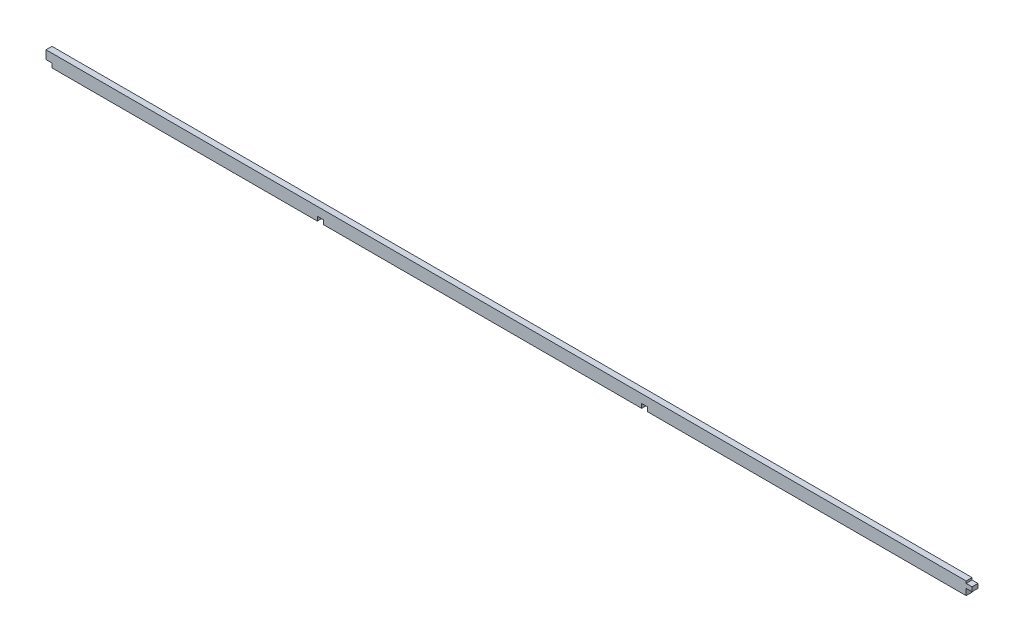
ISO-10303-21;
HEADER;
FILE_DESCRIPTION(('STEP AP214'),'2;1');
FILE_NAME('part.step','',(''),(''),'','','');
FILE_SCHEMA(('AUTOMOTIVE_DESIGN { 1 0 10303 214 1 1 1 1 }'));
ENDSEC;
DATA;
#1=APPLICATION_CONTEXT('core data for automotive mechanical design processes');
#2=APPLICATION_PROTOCOL_DEFINITION('international standard','automotive_design',2000,#1);
#3=PRODUCT_CONTEXT('',#1,'mechanical');
#4=PRODUCT('Part','Part','',(#3));
#5=PRODUCT_RELATED_PRODUCT_CATEGORY('part','',(#4));
#6=PRODUCT_DEFINITION_FORMATION('','',#4);
#7=PRODUCT_DEFINITION_CONTEXT('part definition',#1,'design');
#8=PRODUCT_DEFINITION('design','',#6,#7);
#9=PRODUCT_DEFINITION_SHAPE('','',#8);
#10=(LENGTH_UNIT() NAMED_UNIT(*) SI_UNIT(.MILLI.,.METRE.));
#11=(NAMED_UNIT(*) PLANE_ANGLE_UNIT() SI_UNIT($,.RADIAN.));
#12=(NAMED_UNIT(*) SI_UNIT($,.STERADIAN.) SOLID_ANGLE_UNIT());
#13=UNCERTAINTY_MEASURE_WITH_UNIT(LENGTH_MEASURE(1.E-05),#10,'distance_accuracy_value','');
#14=(GEOMETRIC_REPRESENTATION_CONTEXT(3) GLOBAL_UNCERTAINTY_ASSIGNED_CONTEXT((#13)) GLOBAL_UNIT_ASSIGNED_CONTEXT((#10,
#11,#12)) REPRESENTATION_CONTEXT('',''));
#15=CARTESIAN_POINT('',(0.,0.,0.));
#16=DIRECTION('',(0.,0.,1.));
#17=DIRECTION('',(1.,0.,0.));
#18=AXIS2_PLACEMENT_3D('',#15,#16,#17);
#19=CARTESIAN_POINT('',(433.4,0.,1.4));
#20=DIRECTION('',(-1.,0.,0.));
#21=DIRECTION('',(0.,0.,1.));
#22=AXIS2_PLACEMENT_3D('',#19,#20,#21);
#23=PLANE('',#22);
#24=DIRECTION('',(0.,1.,0.));
#25=VECTOR('',#24,1.);
#26=CARTESIAN_POINT('',(433.4,0.,-1.4));
#27=LINE('',#26,#25);
#28=CARTESIAN_POINT('',(433.4,-1.,-1.4));
#29=VERTEX_POINT('',#28);
#30=CARTESIAN_POINT('',(433.4,0.,-1.4));
#31=VERTEX_POINT('',#30);
#32=EDGE_CURVE('E189',#29,#31,#27,.T.);
#33=ORIENTED_EDGE('',*,*,#32,.T.);
#34=DIRECTION('',(0.,0.,-1.));
#35=VECTOR('',#34,1.);
#36=CARTESIAN_POINT('',(433.4,0.,1.4));
#37=LINE('',#36,#35);
#38=CARTESIAN_POINT('',(433.4,0.,1.4));
#39=VERTEX_POINT('',#38);
#40=EDGE_CURVE('E11',#39,#31,#37,.T.);
#41=ORIENTED_EDGE('',*,*,#40,.F.);
#42=DIRECTION('',(0.,1.,0.));
#43=VECTOR('',#42,1.);
#44=CARTESIAN_POINT('',(433.4,0.,1.4));
#45=LINE('',#44,#43);
#46=CARTESIAN_POINT('',(433.4,-1.,1.4));
#47=VERTEX_POINT('',#46);
#48=EDGE_CURVE('E223',#47,#39,#45,.T.);
#49=ORIENTED_EDGE('',*,*,#48,.F.);
#50=DIRECTION('',(0.,0.,-1.));
#51=VECTOR('',#50,1.);
#52=CARTESIAN_POINT('',(433.4,-1.,1.4));
#53=LINE('',#52,#51);
#54=EDGE_CURVE('E185',#47,#29,#53,.T.);
#55=ORIENTED_EDGE('',*,*,#54,.T.);
#56=EDGE_LOOP('',(#33,#41,#49,#55));
#57=FACE_BOUND('',#56,.T.);
#58=ADVANCED_FACE('F33',(#57),#23,.F.);
#59=CARTESIAN_POINT('',(0.,0.,1.4));
#60=DIRECTION('',(0.,-1.,0.));
#61=DIRECTION('',(0.,0.,-1.));
#62=AXIS2_PLACEMENT_3D('',#59,#60,#61);
#63=PLANE('',#62);
#64=DIRECTION('',(-1.,0.,0.));
#65=VECTOR('',#64,1.);
#66=CARTESIAN_POINT('',(0.,0.,-1.4));
#67=LINE('',#66,#65);
#68=CARTESIAN_POINT('',(0.,0.,-1.4));
#69=VERTEX_POINT('',#68);
#70=EDGE_CURVE('E192',#31,#69,#67,.T.);
#71=ORIENTED_EDGE('',*,*,#70,.T.);
#72=DIRECTION('',(0.,0.,-1.));
#73=VECTOR('',#72,1.);
#74=CARTESIAN_POINT('',(0.,0.,1.4));
#75=LINE('',#74,#73);
#76=CARTESIAN_POINT('',(0.,0.,1.4));
#77=VERTEX_POINT('',#76);
#78=EDGE_CURVE('E41',#77,#69,#75,.T.);
#79=ORIENTED_EDGE('',*,*,#78,.F.);
#80=DIRECTION('',(-1.,0.,0.));
#81=VECTOR('',#80,1.);
#82=CARTESIAN_POINT('',(0.,0.,1.4));
#83=LINE('',#82,#81);
#84=EDGE_CURVE('E122',#39,#77,#83,.T.);
#85=ORIENTED_EDGE('',*,*,#84,.F.);
#86=ORIENTED_EDGE('',*,*,#40,.T.);
#87=EDGE_LOOP('',(#71,#79,#85,#86));
#88=FACE_BOUND('',#87,.T.);
#89=ADVANCED_FACE('F331',(#88),#63,.F.);
#90=CARTESIAN_POINT('',(0.,-4.,1.4));
#91=DIRECTION('',(1.,0.,0.));
#92=DIRECTION('',(0.,0.,-1.));
#93=AXIS2_PLACEMENT_3D('',#90,#91,#92);
#94=PLANE('',#93);
#95=DIRECTION('',(0.,-1.,0.));
#96=VECTOR('',#95,1.);
#97=CARTESIAN_POINT('',(0.,-4.,-1.4));
#98=LINE('',#97,#96);
#99=CARTESIAN_POINT('',(0.,-4.,-1.4));
#100=VERTEX_POINT('',#99);
#101=EDGE_CURVE('E194',#69,#100,#98,.T.);
#102=ORIENTED_EDGE('',*,*,#101,.T.);
#103=DIRECTION('',(0.,0.,-1.));
#104=VECTOR('',#103,1.);
#105=CARTESIAN_POINT('',(0.,-4.,1.4));
#106=LINE('',#105,#104);
#107=CARTESIAN_POINT('',(0.,-4.,1.4));
#108=VERTEX_POINT('',#107);
#109=EDGE_CURVE('E260',#108,#100,#106,.T.);
#110=ORIENTED_EDGE('',*,*,#109,.F.);
#111=DIRECTION('',(0.,-1.,0.));
#112=VECTOR('',#111,1.);
#113=CARTESIAN_POINT('',(0.,-4.,1.4));
#114=LINE('',#113,#112);
#115=EDGE_CURVE('E268',#77,#108,#114,.T.);
#116=ORIENTED_EDGE('',*,*,#115,.F.);
#117=ORIENTED_EDGE('',*,*,#78,.T.);
#118=EDGE_LOOP('',(#102,#110,#116,#117));
#119=FACE_BOUND('',#118,.T.);
#120=ADVANCED_FACE('F266',(#119),#94,.F.);
#121=CARTESIAN_POINT('',(0.,-4.,1.4));
#122=DIRECTION('',(0.,1.,0.));
#123=DIRECTION('',(0.,0.,1.));
#124=AXIS2_PLACEMENT_3D('',#121,#122,#123);
#125=PLANE('',#124);
#126=DIRECTION('',(1.,0.,0.));
#127=VECTOR('',#126,1.);
#128=CARTESIAN_POINT('',(0.,-4.,-1.4));
#129=LINE('',#128,#127);
#130=CARTESIAN_POINT('',(2.80000000000002,-4.,-1.4));
#131=VERTEX_POINT('',#130);
#132=EDGE_CURVE('E196',#100,#131,#129,.T.);
#133=ORIENTED_EDGE('',*,*,#132,.T.);
#134=DIRECTION('',(0.,0.,-1.));
#135=VECTOR('',#134,1.);
#136=CARTESIAN_POINT('',(2.80000000000002,-4.,1.4));
#137=LINE('',#136,#135);
#138=CARTESIAN_POINT('',(2.80000000000002,-4.,1.4));
#139=VERTEX_POINT('',#138);
#140=EDGE_CURVE('E257',#139,#131,#137,.T.);
#141=ORIENTED_EDGE('',*,*,#140,.F.);
#142=DIRECTION('',(1.,0.,0.));
#143=VECTOR('',#142,1.);
#144=CARTESIAN_POINT('',(0.,-4.,1.4));
#145=LINE('',#144,#143);
#146=EDGE_CURVE('E286',#108,#139,#145,.T.);
#147=ORIENTED_EDGE('',*,*,#146,.F.);
#148=ORIENTED_EDGE('',*,*,#109,.T.);
#149=EDGE_LOOP('',(#133,#141,#147,#148));
#150=FACE_BOUND('',#149,.T.);
#151=ADVANCED_FACE('F277',(#150),#125,.F.);
#152=CARTESIAN_POINT('',(2.80000000000002,-4.,1.4));
#153=DIRECTION('',(1.,0.,0.));
#154=DIRECTION('',(0.,1.,0.));
#155=AXIS2_PLACEMENT_3D('',#152,#153,#154);
#156=PLANE('',#155);
#157=DIRECTION('',(0.,-1.,0.));
#158=VECTOR('',#157,1.);
#159=CARTESIAN_POINT('',(2.80000000000002,-4.,-1.4));
#160=LINE('',#159,#158);
#161=CARTESIAN_POINT('',(2.80000000000003,-6.,-1.4));
#162=VERTEX_POINT('',#161);
#163=EDGE_CURVE('E198',#131,#162,#160,.T.);
#164=ORIENTED_EDGE('',*,*,#163,.T.);
#165=DIRECTION('',(0.,0.,-1.));
#166=VECTOR('',#165,1.);
#167=CARTESIAN_POINT('',(2.80000000000003,-6.,1.4));
#168=LINE('',#167,#166);
#169=CARTESIAN_POINT('',(2.80000000000003,-6.,1.4));
#170=VERTEX_POINT('',#169);
#171=EDGE_CURVE('E254',#170,#162,#168,.T.);
#172=ORIENTED_EDGE('',*,*,#171,.F.);
#173=DIRECTION('',(0.,-1.,0.));
#174=VECTOR('',#173,1.);
#175=CARTESIAN_POINT('',(2.80000000000002,-4.,1.4));
#176=LINE('',#175,#174);
#177=EDGE_CURVE('E283',#139,#170,#176,.T.);
#178=ORIENTED_EDGE('',*,*,#177,.F.);
#179=ORIENTED_EDGE('',*,*,#140,.T.);
#180=EDGE_LOOP('',(#164,#172,#178,#179));
#181=FACE_BOUND('',#180,.T.);
#182=ADVANCED_FACE('F281',(#181),#156,.F.);
#183=CARTESIAN_POINT('',(2.80000000000003,-6.,1.4));
#184=DIRECTION('',(0.,1.,0.));
#185=DIRECTION('',(0.,0.,1.));
#186=AXIS2_PLACEMENT_3D('',#183,#184,#185);
#187=PLANE('',#186);
#188=DIRECTION('',(1.,0.,0.));
#189=VECTOR('',#188,1.);
#190=CARTESIAN_POINT('',(2.80000000000003,-6.,-1.4));
#191=LINE('',#190,#189);
#192=CARTESIAN_POINT('',(127.8,-6.,-1.4));
#193=VERTEX_POINT('',#192);
#194=EDGE_CURVE('E200',#162,#193,#191,.T.);
#195=ORIENTED_EDGE('',*,*,#194,.T.);
#196=DIRECTION('',(0.,0.,-1.));
#197=VECTOR('',#196,1.);
#198=CARTESIAN_POINT('',(127.8,-6.,1.4));
#199=LINE('',#198,#197);
#200=CARTESIAN_POINT('',(127.8,-6.,1.4));
#201=VERTEX_POINT('',#200);
#202=EDGE_CURVE('E251',#201,#193,#199,.T.);
#203=ORIENTED_EDGE('',*,*,#202,.F.);
#204=DIRECTION('',(1.,0.,0.));
#205=VECTOR('',#204,1.);
#206=CARTESIAN_POINT('',(2.80000000000003,-6.,1.4));
#207=LINE('',#206,#205);
#208=EDGE_CURVE('E285',#170,#201,#207,.T.);
#209=ORIENTED_EDGE('',*,*,#208,.F.);
#210=ORIENTED_EDGE('',*,*,#171,.T.);
#211=EDGE_LOOP('',(#195,#203,#209,#210));
#212=FACE_BOUND('',#211,.T.);
#213=ADVANCED_FACE('F344',(#212),#187,.F.);
#214=CARTESIAN_POINT('',(127.8,-6.,1.4));
#215=DIRECTION('',(-1.,0.,0.));
#216=DIRECTION('',(0.,0.,1.));
#217=AXIS2_PLACEMENT_3D('',#214,#215,#216);
#218=PLANE('',#217);
#219=DIRECTION('',(0.,1.,0.));
#220=VECTOR('',#219,1.);
#221=CARTESIAN_POINT('',(127.8,-6.,-1.4));
#222=LINE('',#221,#220);
#223=CARTESIAN_POINT('',(127.8,-4.,-1.4));
#224=VERTEX_POINT('',#223);
#225=EDGE_CURVE('E202',#193,#224,#222,.T.);
#226=ORIENTED_EDGE('',*,*,#225,.T.);
#227=DIRECTION('',(0.,0.,-1.));
#228=VECTOR('',#227,1.);
#229=CARTESIAN_POINT('',(127.8,-4.,1.4));
#230=LINE('',#229,#228);
#231=CARTESIAN_POINT('',(127.8,-4.,1.4));
#232=VERTEX_POINT('',#231);
#233=EDGE_CURVE('E248',#232,#224,#230,.T.);
#234=ORIENTED_EDGE('',*,*,#233,.F.);
#235=DIRECTION('',(0.,1.,0.));
#236=VECTOR('',#235,1.);
#237=CARTESIAN_POINT('',(127.8,-6.,1.4));
#238=LINE('',#237,#236);
#239=EDGE_CURVE('E288',#201,#232,#238,.T.);
#240=ORIENTED_EDGE('',*,*,#239,.F.);
#241=ORIENTED_EDGE('',*,*,#202,.T.);
#242=EDGE_LOOP('',(#226,#234,#240,#241));
#243=FACE_BOUND('',#242,.T.);
#244=ADVANCED_FACE('F347',(#243),#218,.F.);
#245=CARTESIAN_POINT('',(127.8,-4.,1.4));
#246=DIRECTION('',(0.,1.,0.));
#247=DIRECTION('',(0.,0.,1.));
#248=AXIS2_PLACEMENT_3D('',#245,#246,#247);
#249=PLANE('',#248);
#250=DIRECTION('',(1.,0.,0.));
#251=VECTOR('',#250,1.);
#252=CARTESIAN_POINT('',(127.8,-4.,-1.4));
#253=LINE('',#252,#251);
#254=CARTESIAN_POINT('',(130.6,-4.,-1.4));
#255=VERTEX_POINT('',#254);
#256=EDGE_CURVE('E204',#224,#255,#253,.T.);
#257=ORIENTED_EDGE('',*,*,#256,.T.);
#258=DIRECTION('',(0.,0.,-1.));
#259=VECTOR('',#258,1.);
#260=CARTESIAN_POINT('',(130.6,-4.,1.4));
#261=LINE('',#260,#259);
#262=CARTESIAN_POINT('',(130.6,-4.,1.4));
#263=VERTEX_POINT('',#262);
#264=EDGE_CURVE('E245',#263,#255,#261,.T.);
#265=ORIENTED_EDGE('',*,*,#264,.F.);
#266=DIRECTION('',(1.,0.,0.));
#267=VECTOR('',#266,1.);
#268=CARTESIAN_POINT('',(127.8,-4.,1.4));
#269=LINE('',#268,#267);
#270=EDGE_CURVE('E294',#232,#263,#269,.T.);
#271=ORIENTED_EDGE('',*,*,#270,.F.);
#272=ORIENTED_EDGE('',*,*,#233,.T.);
#273=EDGE_LOOP('',(#257,#265,#271,#272));
#274=FACE_BOUND('',#273,.T.);
#275=ADVANCED_FACE('F351',(#274),#249,.F.);
#276=CARTESIAN_POINT('',(130.6,-4.,1.4));
#277=DIRECTION('',(1.,0.,0.));
#278=DIRECTION('',(0.,0.,-1.));
#279=AXIS2_PLACEMENT_3D('',#276,#277,#278);
#280=PLANE('',#279);
#281=DIRECTION('',(0.,-1.,0.));
#282=VECTOR('',#281,1.);
#283=CARTESIAN_POINT('',(130.6,-4.,-1.4));
#284=LINE('',#283,#282);
#285=CARTESIAN_POINT('',(130.6,-6.,-1.4));
#286=VERTEX_POINT('',#285);
#287=EDGE_CURVE('E206',#255,#286,#284,.T.);
#288=ORIENTED_EDGE('',*,*,#287,.T.);
#289=DIRECTION('',(0.,0.,-1.));
#290=VECTOR('',#289,1.);
#291=CARTESIAN_POINT('',(130.6,-6.,1.4));
#292=LINE('',#291,#290);
#293=CARTESIAN_POINT('',(130.6,-6.,1.4));
#294=VERTEX_POINT('',#293);
#295=EDGE_CURVE('E242',#294,#286,#292,.T.);
#296=ORIENTED_EDGE('',*,*,#295,.F.);
#297=DIRECTION('',(0.,-1.,0.));
#298=VECTOR('',#297,1.);
#299=CARTESIAN_POINT('',(130.6,-4.,1.4));
#300=LINE('',#299,#298);
#301=EDGE_CURVE('E296',#263,#294,#300,.T.);
#302=ORIENTED_EDGE('',*,*,#301,.F.);
#303=ORIENTED_EDGE('',*,*,#264,.T.);
#304=EDGE_LOOP('',(#288,#296,#302,#303));
#305=FACE_BOUND('',#304,.T.);
#306=ADVANCED_FACE('F355',(#305),#280,.F.);
#307=CARTESIAN_POINT('',(130.6,-6.,1.4));
#308=DIRECTION('',(0.,1.,0.));
#309=DIRECTION('',(0.,0.,1.));
#310=AXIS2_PLACEMENT_3D('',#307,#308,#309);
#311=PLANE('',#310);
#312=DIRECTION('',(1.,0.,0.));
#313=VECTOR('',#312,1.);
#314=CARTESIAN_POINT('',(130.6,-6.,-1.4));
#315=LINE('',#314,#313);
#316=CARTESIAN_POINT('',(280.6,-6.,-1.4));
#317=VERTEX_POINT('',#316);
#318=EDGE_CURVE('E208',#286,#317,#315,.T.);
#319=ORIENTED_EDGE('',*,*,#318,.T.);
#320=DIRECTION('',(0.,0.,-1.));
#321=VECTOR('',#320,1.);
#322=CARTESIAN_POINT('',(280.6,-6.,1.4));
#323=LINE('',#322,#321);
#324=CARTESIAN_POINT('',(280.6,-6.,1.4));
#325=VERTEX_POINT('',#324);
#326=EDGE_CURVE('E239',#325,#317,#323,.T.);
#327=ORIENTED_EDGE('',*,*,#326,.F.);
#328=DIRECTION('',(1.,0.,0.));
#329=VECTOR('',#328,1.);
#330=CARTESIAN_POINT('',(130.6,-6.,1.4));
#331=LINE('',#330,#329);
#332=EDGE_CURVE('E298',#294,#325,#331,.T.);
#333=ORIENTED_EDGE('',*,*,#332,.F.);
#334=ORIENTED_EDGE('',*,*,#295,.T.);
#335=EDGE_LOOP('',(#319,#327,#333,#334));
#336=FACE_BOUND('',#335,.T.);
#337=ADVANCED_FACE('F359',(#336),#311,.F.);
#338=CARTESIAN_POINT('',(280.6,-6.,1.4));
#339=DIRECTION('',(-1.,0.,0.));
#340=DIRECTION('',(0.,0.,1.));
#341=AXIS2_PLACEMENT_3D('',#338,#339,#340);
#342=PLANE('',#341);
#343=DIRECTION('',(0.,1.,0.));
#344=VECTOR('',#343,1.);
#345=CARTESIAN_POINT('',(280.6,-6.,-1.4));
#346=LINE('',#345,#344);
#347=CARTESIAN_POINT('',(280.6,-4.,-1.4));
#348=VERTEX_POINT('',#347);
#349=EDGE_CURVE('E210',#317,#348,#346,.T.);
#350=ORIENTED_EDGE('',*,*,#349,.T.);
#351=DIRECTION('',(0.,0.,-1.));
#352=VECTOR('',#351,1.);
#353=CARTESIAN_POINT('',(280.6,-4.,1.4));
#354=LINE('',#353,#352);
#355=CARTESIAN_POINT('',(280.6,-4.,1.4));
#356=VERTEX_POINT('',#355);
#357=EDGE_CURVE('E236',#356,#348,#354,.T.);
#358=ORIENTED_EDGE('',*,*,#357,.F.);
#359=DIRECTION('',(0.,1.,0.));
#360=VECTOR('',#359,1.);
#361=CARTESIAN_POINT('',(280.6,-6.,1.4));
#362=LINE('',#361,#360);
#363=EDGE_CURVE('E300',#325,#356,#362,.T.);
#364=ORIENTED_EDGE('',*,*,#363,.F.);
#365=ORIENTED_EDGE('',*,*,#326,.T.);
#366=EDGE_LOOP('',(#350,#358,#364,#365));
#367=FACE_BOUND('',#366,.T.);
#368=ADVANCED_FACE('F363',(#367),#342,.F.);
#369=CARTESIAN_POINT('',(280.6,-4.,1.4));
#370=DIRECTION('',(0.,1.,0.));
#371=DIRECTION('',(-1.,0.,0.));
#372=AXIS2_PLACEMENT_3D('',#369,#370,#371);
#373=PLANE('',#372);
#374=DIRECTION('',(1.,0.,0.));
#375=VECTOR('',#374,1.);
#376=CARTESIAN_POINT('',(280.6,-4.,-1.4));
#377=LINE('',#376,#375);
#378=CARTESIAN_POINT('',(283.4,-4.,-1.4));
#379=VERTEX_POINT('',#378);
#380=EDGE_CURVE('E212',#348,#379,#377,.T.);
#381=ORIENTED_EDGE('',*,*,#380,.T.);
#382=DIRECTION('',(0.,0.,-1.));
#383=VECTOR('',#382,1.);
#384=CARTESIAN_POINT('',(283.4,-4.,1.4));
#385=LINE('',#384,#383);
#386=CARTESIAN_POINT('',(283.4,-4.,1.4));
#387=VERTEX_POINT('',#386);
#388=EDGE_CURVE('E233',#387,#379,#385,.T.);
#389=ORIENTED_EDGE('',*,*,#388,.F.);
#390=DIRECTION('',(1.,0.,0.));
#391=VECTOR('',#390,1.);
#392=CARTESIAN_POINT('',(280.6,-4.,1.4));
#393=LINE('',#392,#391);
#394=EDGE_CURVE('E302',#356,#387,#393,.T.);
#395=ORIENTED_EDGE('',*,*,#394,.F.);
#396=ORIENTED_EDGE('',*,*,#357,.T.);
#397=EDGE_LOOP('',(#381,#389,#395,#396));
#398=FACE_BOUND('',#397,.T.);
#399=ADVANCED_FACE('F367',(#398),#373,.F.);
#400=CARTESIAN_POINT('',(283.4,-4.,1.4));
#401=DIRECTION('',(1.,0.,0.));
#402=DIRECTION('',(0.,0.,-1.));
#403=AXIS2_PLACEMENT_3D('',#400,#401,#402);
#404=PLANE('',#403);
#405=DIRECTION('',(0.,-1.,0.));
#406=VECTOR('',#405,1.);
#407=CARTESIAN_POINT('',(283.4,-4.,-1.4));
#408=LINE('',#407,#406);
#409=CARTESIAN_POINT('',(283.4,-6.,-1.4));
#410=VERTEX_POINT('',#409);
#411=EDGE_CURVE('E214',#379,#410,#408,.T.);
#412=ORIENTED_EDGE('',*,*,#411,.T.);
#413=DIRECTION('',(0.,0.,-1.));
#414=VECTOR('',#413,1.);
#415=CARTESIAN_POINT('',(283.4,-6.,1.4));
#416=LINE('',#415,#414);
#417=CARTESIAN_POINT('',(283.4,-6.,1.4));
#418=VERTEX_POINT('',#417);
#419=EDGE_CURVE('E230',#418,#410,#416,.T.);
#420=ORIENTED_EDGE('',*,*,#419,.F.);
#421=DIRECTION('',(0.,-1.,0.));
#422=VECTOR('',#421,1.);
#423=CARTESIAN_POINT('',(283.4,-4.,1.4));
#424=LINE('',#423,#422);
#425=EDGE_CURVE('E304',#387,#418,#424,.T.);
#426=ORIENTED_EDGE('',*,*,#425,.F.);
#427=ORIENTED_EDGE('',*,*,#388,.T.);
#428=EDGE_LOOP('',(#412,#420,#426,#427));
#429=FACE_BOUND('',#428,.T.);
#430=ADVANCED_FACE('F371',(#429),#404,.F.);
#431=CARTESIAN_POINT('',(283.4,-6.,1.4));
#432=DIRECTION('',(0.,1.,0.));
#433=DIRECTION('',(0.,0.,1.));
#434=AXIS2_PLACEMENT_3D('',#431,#432,#433);
#435=PLANE('',#434);
#436=DIRECTION('',(1.,0.,0.));
#437=VECTOR('',#436,1.);
#438=CARTESIAN_POINT('',(283.4,-6.,-1.4));
#439=LINE('',#438,#437);
#440=CARTESIAN_POINT('',(433.4,-6.,-1.4));
#441=VERTEX_POINT('',#440);
#442=EDGE_CURVE('E216',#410,#441,#439,.T.);
#443=ORIENTED_EDGE('',*,*,#442,.T.);
#444=DIRECTION('',(0.,0.,-1.));
#445=VECTOR('',#444,1.);
#446=CARTESIAN_POINT('',(433.4,-6.,1.4));
#447=LINE('',#446,#445);
#448=CARTESIAN_POINT('',(433.4,-6.,1.4));
#449=VERTEX_POINT('',#448);
#450=EDGE_CURVE('E227',#449,#441,#447,.T.);
#451=ORIENTED_EDGE('',*,*,#450,.F.);
#452=DIRECTION('',(1.,0.,0.));
#453=VECTOR('',#452,1.);
#454=CARTESIAN_POINT('',(283.4,-6.,1.4));
#455=LINE('',#454,#453);
#456=EDGE_CURVE('E306',#418,#449,#455,.T.);
#457=ORIENTED_EDGE('',*,*,#456,.F.);
#458=ORIENTED_EDGE('',*,*,#419,.T.);
#459=EDGE_LOOP('',(#443,#451,#457,#458));
#460=FACE_BOUND('',#459,.T.);
#461=ADVANCED_FACE('F312',(#460),#435,.F.);
#462=CARTESIAN_POINT('',(433.4,-3.,1.4));
#463=DIRECTION('',(-1.,0.,0.));
#464=DIRECTION('',(0.,0.,1.));
#465=AXIS2_PLACEMENT_3D('',#462,#463,#464);
#466=PLANE('',#465);
#467=DIRECTION('',(0.,1.,0.));
#468=VECTOR('',#467,1.);
#469=CARTESIAN_POINT('',(433.4,-3.,-1.4));
#470=LINE('',#469,#468);
#471=CARTESIAN_POINT('',(433.4,-3.,-1.4));
#472=VERTEX_POINT('',#471);
#473=EDGE_CURVE('E218',#441,#472,#470,.T.);
#474=ORIENTED_EDGE('',*,*,#473,.T.);
#475=DIRECTION('',(0.,0.,-1.));
#476=VECTOR('',#475,1.);
#477=CARTESIAN_POINT('',(433.4,-3.,1.4));
#478=LINE('',#477,#476);
#479=CARTESIAN_POINT('',(433.4,-3.,1.4));
#480=VERTEX_POINT('',#479);
#481=EDGE_CURVE('E180',#480,#472,#478,.T.);
#482=ORIENTED_EDGE('',*,*,#481,.F.);
#483=DIRECTION('',(0.,1.,0.));
#484=VECTOR('',#483,1.);
#485=CARTESIAN_POINT('',(433.4,-3.,1.4));
#486=LINE('',#485,#484);
#487=EDGE_CURVE('E171',#449,#480,#486,.T.);
#488=ORIENTED_EDGE('',*,*,#487,.F.);
#489=ORIENTED_EDGE('',*,*,#450,.T.);
#490=EDGE_LOOP('',(#474,#482,#488,#489));
#491=FACE_BOUND('',#490,.T.);
#492=ADVANCED_FACE('F316',(#491),#466,.F.);
#493=CARTESIAN_POINT('',(433.4,-3.,1.4));
#494=DIRECTION('',(0.,1.,0.));
#495=DIRECTION('',(0.,0.,1.));
#496=AXIS2_PLACEMENT_3D('',#493,#494,#495);
#497=PLANE('',#496);
#498=DIRECTION('',(1.,0.,0.));
#499=VECTOR('',#498,1.);
#500=CARTESIAN_POINT('',(433.4,-3.,-1.4));
#501=LINE('',#500,#499);
#502=CARTESIAN_POINT('',(436.2,-3.,-1.4));
#503=VERTEX_POINT('',#502);
#504=EDGE_CURVE('E179',#472,#503,#501,.T.);
#505=ORIENTED_EDGE('',*,*,#504,.T.);
#506=DIRECTION('',(0.,0.,-1.));
#507=VECTOR('',#506,1.);
#508=CARTESIAN_POINT('',(436.2,-3.,1.4));
#509=LINE('',#508,#507);
#510=CARTESIAN_POINT('',(436.2,-3.,1.4));
#511=VERTEX_POINT('',#510);
#512=EDGE_CURVE('E176',#511,#503,#509,.T.);
#513=ORIENTED_EDGE('',*,*,#512,.F.);
#514=DIRECTION('',(1.,0.,0.));
#515=VECTOR('',#514,1.);
#516=CARTESIAN_POINT('',(433.4,-3.,1.4));
#517=LINE('',#516,#515);
#518=EDGE_CURVE('E165',#480,#511,#517,.T.);
#519=ORIENTED_EDGE('',*,*,#518,.F.);
#520=ORIENTED_EDGE('',*,*,#481,.T.);
#521=EDGE_LOOP('',(#505,#513,#519,#520));
#522=FACE_BOUND('',#521,.T.);
#523=ADVANCED_FACE('F177',(#522),#497,.F.);
#524=CARTESIAN_POINT('',(436.2,-3.,1.4));
#525=DIRECTION('',(-1.,0.,0.));
#526=DIRECTION('',(0.,0.,1.));
#527=AXIS2_PLACEMENT_3D('',#524,#525,#526);
#528=PLANE('',#527);
#529=DIRECTION('',(0.,1.,0.));
#530=VECTOR('',#529,1.);
#531=CARTESIAN_POINT('',(436.2,-3.,-1.4));
#532=LINE('',#531,#530);
#533=CARTESIAN_POINT('',(436.2,-1.,-1.4));
#534=VERTEX_POINT('',#533);
#535=EDGE_CURVE('E108',#503,#534,#532,.T.);
#536=ORIENTED_EDGE('',*,*,#535,.T.);
#537=DIRECTION('',(0.,0.,-1.));
#538=VECTOR('',#537,1.);
#539=CARTESIAN_POINT('',(436.2,-1.,1.4));
#540=LINE('',#539,#538);
#541=CARTESIAN_POINT('',(436.2,-1.,1.4));
#542=VERTEX_POINT('',#541);
#543=EDGE_CURVE('E181',#542,#534,#540,.T.);
#544=ORIENTED_EDGE('',*,*,#543,.F.);
#545=DIRECTION('',(0.,1.,0.));
#546=VECTOR('',#545,1.);
#547=CARTESIAN_POINT('',(436.2,-3.,1.4));
#548=LINE('',#547,#546);
#549=EDGE_CURVE('E169',#511,#542,#548,.T.);
#550=ORIENTED_EDGE('',*,*,#549,.F.);
#551=ORIENTED_EDGE('',*,*,#512,.T.);
#552=EDGE_LOOP('',(#536,#544,#550,#551));
#553=FACE_BOUND('',#552,.T.);
#554=ADVANCED_FACE('F183',(#553),#528,.F.);
#555=CARTESIAN_POINT('',(433.4,-1.,1.4));
#556=DIRECTION('',(0.,-1.,0.));
#557=DIRECTION('',(0.,0.,-1.));
#558=AXIS2_PLACEMENT_3D('',#555,#556,#557);
#559=PLANE('',#558);
#560=DIRECTION('',(-1.,0.,0.));
#561=VECTOR('',#560,1.);
#562=CARTESIAN_POINT('',(433.4,-1.,-1.4));
#563=LINE('',#562,#561);
#564=EDGE_CURVE('E114',#534,#29,#563,.T.);
#565=ORIENTED_EDGE('',*,*,#564,.T.);
#566=ORIENTED_EDGE('',*,*,#54,.F.);
#567=DIRECTION('',(-1.,0.,0.));
#568=VECTOR('',#567,1.);
#569=CARTESIAN_POINT('',(433.4,-1.,1.4));
#570=LINE('',#569,#568);
#571=EDGE_CURVE('E49',#542,#47,#570,.T.);
#572=ORIENTED_EDGE('',*,*,#571,.F.);
#573=ORIENTED_EDGE('',*,*,#543,.T.);
#574=EDGE_LOOP('',(#565,#566,#572,#573));
#575=FACE_BOUND('',#574,.T.);
#576=ADVANCED_FACE('F320',(#575),#559,.F.);
#577=CARTESIAN_POINT('',(0.,0.,1.4));
#578=DIRECTION('',(0.,0.,1.));
#579=DIRECTION('',(1.,0.,0.));
#580=AXIS2_PLACEMENT_3D('',#577,#578,#579);
#581=PLANE('',#580);
#582=ORIENTED_EDGE('',*,*,#48,.T.);
#583=ORIENTED_EDGE('',*,*,#84,.T.);
#584=ORIENTED_EDGE('',*,*,#115,.T.);
#585=ORIENTED_EDGE('',*,*,#146,.T.);
#586=ORIENTED_EDGE('',*,*,#177,.T.);
#587=ORIENTED_EDGE('',*,*,#208,.T.);
#588=ORIENTED_EDGE('',*,*,#239,.T.);
#589=ORIENTED_EDGE('',*,*,#270,.T.);
#590=ORIENTED_EDGE('',*,*,#301,.T.);
#591=ORIENTED_EDGE('',*,*,#332,.T.);
#592=ORIENTED_EDGE('',*,*,#363,.T.);
#593=ORIENTED_EDGE('',*,*,#394,.T.);
#594=ORIENTED_EDGE('',*,*,#425,.T.);
#595=ORIENTED_EDGE('',*,*,#456,.T.);
#596=ORIENTED_EDGE('',*,*,#487,.T.);
#597=ORIENTED_EDGE('',*,*,#518,.T.);
#598=ORIENTED_EDGE('',*,*,#549,.T.);
#599=ORIENTED_EDGE('',*,*,#571,.T.);
#600=EDGE_LOOP('',(#582,#583,#584,#585,#586,#587,#588,#589,#590,#591,#592,#593,#594,#595,#596,
#597,#598,#599));
#601=FACE_BOUND('',#600,.T.);
#602=ADVANCED_FACE('F167',(#601),#581,.T.);
#603=CARTESIAN_POINT('',(0.,0.,-1.4));
#604=DIRECTION('',(0.,0.,1.));
#605=DIRECTION('',(1.,0.,0.));
#606=AXIS2_PLACEMENT_3D('',#603,#604,#605);
#607=PLANE('',#606);
#608=ORIENTED_EDGE('',*,*,#32,.F.);
#609=ORIENTED_EDGE('',*,*,#564,.F.);
#610=ORIENTED_EDGE('',*,*,#535,.F.);
#611=ORIENTED_EDGE('',*,*,#504,.F.);
#612=ORIENTED_EDGE('',*,*,#473,.F.);
#613=ORIENTED_EDGE('',*,*,#442,.F.);
#614=ORIENTED_EDGE('',*,*,#411,.F.);
#615=ORIENTED_EDGE('',*,*,#380,.F.);
#616=ORIENTED_EDGE('',*,*,#349,.F.);
#617=ORIENTED_EDGE('',*,*,#318,.F.);
#618=ORIENTED_EDGE('',*,*,#287,.F.);
#619=ORIENTED_EDGE('',*,*,#256,.F.);
#620=ORIENTED_EDGE('',*,*,#225,.F.);
#621=ORIENTED_EDGE('',*,*,#194,.F.);
#622=ORIENTED_EDGE('',*,*,#163,.F.);
#623=ORIENTED_EDGE('',*,*,#132,.F.);
#624=ORIENTED_EDGE('',*,*,#101,.F.);
#625=ORIENTED_EDGE('',*,*,#70,.F.);
#626=EDGE_LOOP('',(#608,#609,#610,#611,#612,#613,#614,#615,#616,#617,#618,#619,#620,#621,#622,
#623,#624,#625));
#627=FACE_BOUND('',#626,.T.);
#628=ADVANCED_FACE('F272',(#627),#607,.F.);
#629=CLOSED_SHELL('',(#58,#89,#120,#151,#182,#213,#244,#275,#306,#337,#368,#399,#430,#461,#492,
#523,#554,#576,#602,#628));
#630=MANIFOLD_SOLID_BREP('B2',#629);
#631=ADVANCED_BREP_SHAPE_REPRESENTATION('',(#18,#630),#14);
#632=SHAPE_DEFINITION_REPRESENTATION(#9,#631);
ENDSEC;
END-ISO-10303-21;
